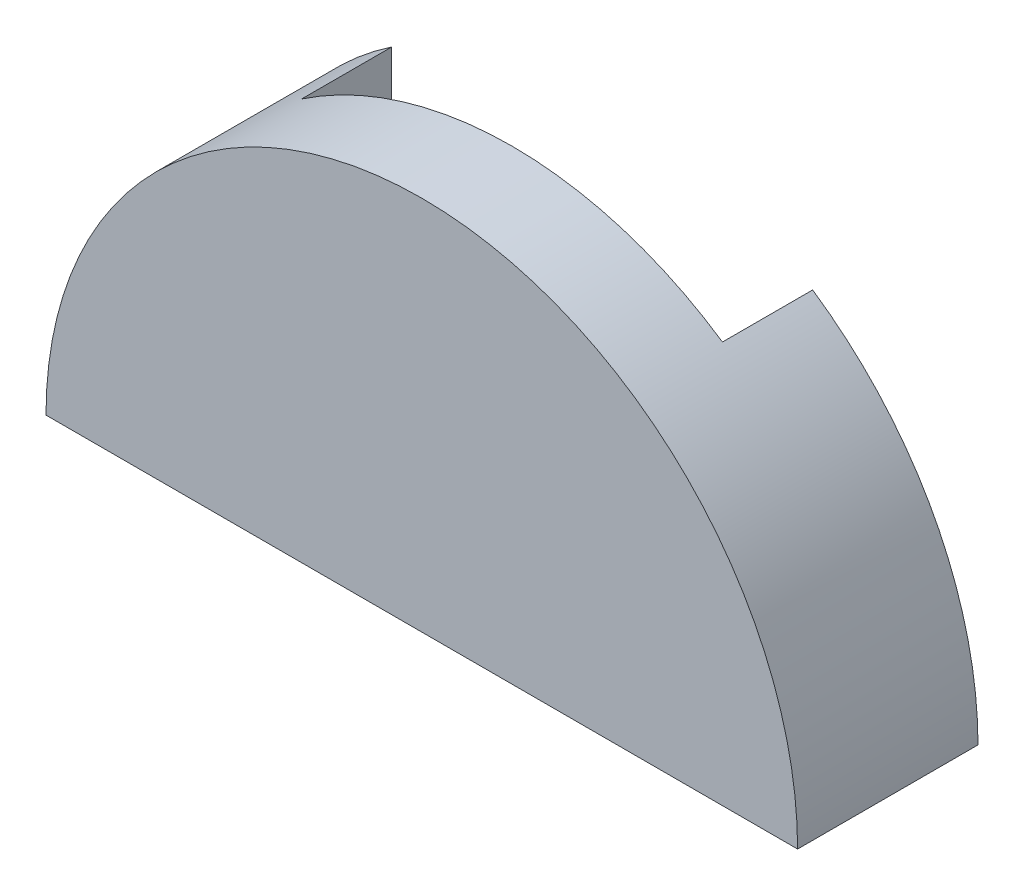
ISO-10303-21;
HEADER;
FILE_DESCRIPTION(('STEP AP214'),'2;1');
FILE_NAME('part.step','',(''),(''),'','','');
FILE_SCHEMA(('AUTOMOTIVE_DESIGN { 1 0 10303 214 1 1 1 1 }'));
ENDSEC;
DATA;
#1=APPLICATION_CONTEXT('core data for automotive mechanical design processes');
#2=APPLICATION_PROTOCOL_DEFINITION('international standard','automotive_design',2000,#1);
#3=PRODUCT_CONTEXT('',#1,'mechanical');
#4=PRODUCT('Part','Part','',(#3));
#5=PRODUCT_RELATED_PRODUCT_CATEGORY('part','',(#4));
#6=PRODUCT_DEFINITION_FORMATION('','',#4);
#7=PRODUCT_DEFINITION_CONTEXT('part definition',#1,'design');
#8=PRODUCT_DEFINITION('design','',#6,#7);
#9=PRODUCT_DEFINITION_SHAPE('','',#8);
#10=(LENGTH_UNIT() NAMED_UNIT(*) SI_UNIT(.MILLI.,.METRE.));
#11=(NAMED_UNIT(*) PLANE_ANGLE_UNIT() SI_UNIT($,.RADIAN.));
#12=(NAMED_UNIT(*) SI_UNIT($,.STERADIAN.) SOLID_ANGLE_UNIT());
#13=UNCERTAINTY_MEASURE_WITH_UNIT(LENGTH_MEASURE(1.E-05),#10,'distance_accuracy_value','');
#14=(GEOMETRIC_REPRESENTATION_CONTEXT(3) GLOBAL_UNCERTAINTY_ASSIGNED_CONTEXT((#13)) GLOBAL_UNIT_ASSIGNED_CONTEXT((#10,
#11,#12)) REPRESENTATION_CONTEXT('',''));
#15=CARTESIAN_POINT('',(0.,0.,0.));
#16=DIRECTION('',(0.,0.,1.));
#17=DIRECTION('',(1.,0.,0.));
#18=AXIS2_PLACEMENT_3D('',#15,#16,#17);
#19=CARTESIAN_POINT('',(0.,0.,7.62));
#20=DIRECTION('',(0.,1.,0.));
#21=DIRECTION('',(0.,0.,1.));
#22=AXIS2_PLACEMENT_3D('',#19,#20,#21);
#23=PLANE('',#22);
#24=DIRECTION('',(1.,0.,0.));
#25=VECTOR('',#24,1.);
#26=CARTESIAN_POINT('',(0.,0.,-7.62));
#27=LINE('',#26,#25);
#28=CARTESIAN_POINT('',(-31.75,0.,-7.62));
#29=VERTEX_POINT('',#28);
#30=CARTESIAN_POINT('',(31.75,0.,-7.62));
#31=VERTEX_POINT('',#30);
#32=EDGE_CURVE('E91',#29,#31,#27,.T.);
#33=ORIENTED_EDGE('',*,*,#32,.T.);
#34=DIRECTION('',(0.,0.,-1.));
#35=VECTOR('',#34,1.);
#36=CARTESIAN_POINT('',(31.75,0.,7.62));
#37=LINE('',#36,#35);
#38=CARTESIAN_POINT('',(31.75,0.,7.62));
#39=VERTEX_POINT('',#38);
#40=EDGE_CURVE('E11',#39,#31,#37,.T.);
#41=ORIENTED_EDGE('',*,*,#40,.F.);
#42=DIRECTION('',(1.,0.,0.));
#43=VECTOR('',#42,1.);
#44=CARTESIAN_POINT('',(0.,0.,7.62));
#45=LINE('',#44,#43);
#46=CARTESIAN_POINT('',(-31.75,0.,7.62));
#47=VERTEX_POINT('',#46);
#48=EDGE_CURVE('E96',#47,#39,#45,.T.);
#49=ORIENTED_EDGE('',*,*,#48,.F.);
#50=DIRECTION('',(0.,0.,-1.));
#51=VECTOR('',#50,1.);
#52=CARTESIAN_POINT('',(-31.75,0.,7.62));
#53=LINE('',#52,#51);
#54=EDGE_CURVE('E49',#47,#29,#53,.T.);
#55=ORIENTED_EDGE('',*,*,#54,.T.);
#56=EDGE_LOOP('',(#33,#41,#49,#55));
#57=FACE_BOUND('',#56,.T.);
#58=ADVANCED_FACE('F41',(#57),#23,.F.);
#59=CARTESIAN_POINT('',(0.,0.,7.62));
#60=DIRECTION('',(0.,0.,-1.));
#61=DIRECTION('',(-1.,0.,0.));
#62=AXIS2_PLACEMENT_3D('',#59,#60,#61);
#63=CYLINDRICAL_SURFACE('',#62,31.75);
#64=CARTESIAN_POINT('',(0.,0.,-7.62));
#65=DIRECTION('',(0.,0.,1.));
#66=DIRECTION('',(1.,0.,0.));
#67=AXIS2_PLACEMENT_3D('',#64,#65,#66);
#68=CIRCLE('',#67,31.75);
#69=CARTESIAN_POINT('',(17.78,26.3046402750541,-7.62));
#70=VERTEX_POINT('',#69);
#71=EDGE_CURVE('E90',#31,#70,#68,.T.);
#72=ORIENTED_EDGE('',*,*,#71,.T.);
#73=DIRECTION('',(0.,0.,1.));
#74=VECTOR('',#73,1.);
#75=CARTESIAN_POINT('',(17.78,26.3046402750541,-7.62));
#76=LINE('',#75,#74);
#77=CARTESIAN_POINT('',(17.78,26.3046402750541,0.));
#78=VERTEX_POINT('',#77);
#79=EDGE_CURVE('E115',#70,#78,#76,.T.);
#80=ORIENTED_EDGE('',*,*,#79,.T.);
#81=CARTESIAN_POINT('',(0.,0.,0.));
#82=DIRECTION('',(0.,0.,1.));
#83=DIRECTION('',(1.,0.,0.));
#84=AXIS2_PLACEMENT_3D('',#81,#82,#83);
#85=CIRCLE('',#84,31.75);
#86=CARTESIAN_POINT('',(-17.78,26.3046402750541,0.));
#87=VERTEX_POINT('',#86);
#88=EDGE_CURVE('E131',#78,#87,#85,.T.);
#89=ORIENTED_EDGE('',*,*,#88,.T.);
#90=DIRECTION('',(0.,0.,1.));
#91=VECTOR('',#90,1.);
#92=CARTESIAN_POINT('',(-17.78,26.3046402750541,-7.62));
#93=LINE('',#92,#91);
#94=CARTESIAN_POINT('',(-17.78,26.3046402750541,-7.62));
#95=VERTEX_POINT('',#94);
#96=EDGE_CURVE('E85',#95,#87,#93,.T.);
#97=ORIENTED_EDGE('',*,*,#96,.F.);
#98=EDGE_CURVE('E77',#95,#29,#68,.T.);
#99=ORIENTED_EDGE('',*,*,#98,.T.);
#100=ORIENTED_EDGE('',*,*,#54,.F.);
#101=CARTESIAN_POINT('',(0.,0.,7.62));
#102=DIRECTION('',(0.,0.,1.));
#103=DIRECTION('',(1.,0.,0.));
#104=AXIS2_PLACEMENT_3D('',#101,#102,#103);
#105=CIRCLE('',#104,31.75);
#106=EDGE_CURVE('E64',#39,#47,#105,.T.);
#107=ORIENTED_EDGE('',*,*,#106,.F.);
#108=ORIENTED_EDGE('',*,*,#40,.T.);
#109=EDGE_LOOP('',(#72,#80,#89,#97,#99,#100,#107,#108));
#110=FACE_BOUND('',#109,.T.);
#111=ADVANCED_FACE('F80',(#110),#63,.T.);
#112=CARTESIAN_POINT('',(0.,0.,7.62));
#113=DIRECTION('',(0.,0.,1.));
#114=DIRECTION('',(1.,0.,0.));
#115=AXIS2_PLACEMENT_3D('',#112,#113,#114);
#116=PLANE('',#115);
#117=ORIENTED_EDGE('',*,*,#48,.T.);
#118=ORIENTED_EDGE('',*,*,#106,.T.);
#119=EDGE_LOOP('',(#117,#118));
#120=FACE_BOUND('',#119,.T.);
#121=ADVANCED_FACE('F179',(#120),#116,.T.);
#122=CARTESIAN_POINT('',(0.,0.,-7.62));
#123=DIRECTION('',(0.,0.,1.));
#124=DIRECTION('',(1.,0.,0.));
#125=AXIS2_PLACEMENT_3D('',#122,#123,#124);
#126=PLANE('',#125);
#127=DIRECTION('',(1.,0.,0.));
#128=VECTOR('',#127,1.);
#129=CARTESIAN_POINT('',(0.,7.62,-7.62));
#130=LINE('',#129,#128);
#131=CARTESIAN_POINT('',(-17.78,7.62,-7.62));
#132=VERTEX_POINT('',#131);
#133=CARTESIAN_POINT('',(17.78,7.62,-7.62));
#134=VERTEX_POINT('',#133);
#135=EDGE_CURVE('E56',#132,#134,#130,.T.);
#136=ORIENTED_EDGE('',*,*,#135,.T.);
#137=DIRECTION('',(0.,1.,0.));
#138=VECTOR('',#137,1.);
#139=CARTESIAN_POINT('',(17.78,0.,-7.62));
#140=LINE('',#139,#138);
#141=EDGE_CURVE('E126',#134,#70,#140,.T.);
#142=ORIENTED_EDGE('',*,*,#141,.T.);
#143=ORIENTED_EDGE('',*,*,#71,.F.);
#144=ORIENTED_EDGE('',*,*,#32,.F.);
#145=ORIENTED_EDGE('',*,*,#98,.F.);
#146=DIRECTION('',(0.,1.,0.));
#147=VECTOR('',#146,1.);
#148=CARTESIAN_POINT('',(-17.78,0.,-7.62));
#149=LINE('',#148,#147);
#150=EDGE_CURVE('E140',#132,#95,#149,.T.);
#151=ORIENTED_EDGE('',*,*,#150,.F.);
#152=EDGE_LOOP('',(#136,#142,#143,#144,#145,#151));
#153=FACE_BOUND('',#152,.T.);
#154=ADVANCED_FACE('F98',(#153),#126,.F.);
#155=CARTESIAN_POINT('',(17.78,0.,-7.62));
#156=DIRECTION('',(1.,0.,0.));
#157=DIRECTION('',(0.,1.,0.));
#158=AXIS2_PLACEMENT_3D('',#155,#156,#157);
#159=PLANE('',#158);
#160=DIRECTION('',(0.,1.,0.));
#161=VECTOR('',#160,1.);
#162=CARTESIAN_POINT('',(17.78,0.,0.));
#163=LINE('',#162,#161);
#164=CARTESIAN_POINT('',(17.78,7.62,0.));
#165=VERTEX_POINT('',#164);
#166=EDGE_CURVE('E134',#165,#78,#163,.T.);
#167=ORIENTED_EDGE('',*,*,#166,.T.);
#168=ORIENTED_EDGE('',*,*,#79,.F.);
#169=ORIENTED_EDGE('',*,*,#141,.F.);
#170=DIRECTION('',(0.,0.,1.));
#171=VECTOR('',#170,1.);
#172=CARTESIAN_POINT('',(17.78,7.62,-7.62));
#173=LINE('',#172,#171);
#174=EDGE_CURVE('E101',#134,#165,#173,.T.);
#175=ORIENTED_EDGE('',*,*,#174,.T.);
#176=EDGE_LOOP('',(#167,#168,#169,#175));
#177=FACE_BOUND('',#176,.T.);
#178=ADVANCED_FACE('F150',(#177),#159,.F.);
#179=CARTESIAN_POINT('',(0.,7.62,-7.62));
#180=DIRECTION('',(0.,-1.,0.));
#181=DIRECTION('',(1.,0.,0.));
#182=AXIS2_PLACEMENT_3D('',#179,#180,#181);
#183=PLANE('',#182);
#184=DIRECTION('',(1.,0.,0.));
#185=VECTOR('',#184,1.);
#186=CARTESIAN_POINT('',(0.,7.62,0.));
#187=LINE('',#186,#185);
#188=CARTESIAN_POINT('',(-17.78,7.62,0.));
#189=VERTEX_POINT('',#188);
#190=EDGE_CURVE('E122',#189,#165,#187,.T.);
#191=ORIENTED_EDGE('',*,*,#190,.T.);
#192=ORIENTED_EDGE('',*,*,#174,.F.);
#193=ORIENTED_EDGE('',*,*,#135,.F.);
#194=DIRECTION('',(0.,0.,1.));
#195=VECTOR('',#194,1.);
#196=CARTESIAN_POINT('',(-17.78,7.62,-7.62));
#197=LINE('',#196,#195);
#198=EDGE_CURVE('E105',#132,#189,#197,.T.);
#199=ORIENTED_EDGE('',*,*,#198,.T.);
#200=EDGE_LOOP('',(#191,#192,#193,#199));
#201=FACE_BOUND('',#200,.T.);
#202=ADVANCED_FACE('F162',(#201),#183,.F.);
#203=CARTESIAN_POINT('',(-17.78,0.,-7.62));
#204=DIRECTION('',(1.,0.,0.));
#205=DIRECTION('',(0.,1.,0.));
#206=AXIS2_PLACEMENT_3D('',#203,#204,#205);
#207=PLANE('',#206);
#208=DIRECTION('',(0.,1.,0.));
#209=VECTOR('',#208,1.);
#210=CARTESIAN_POINT('',(-17.78,0.,0.));
#211=LINE('',#210,#209);
#212=EDGE_CURVE('E127',#189,#87,#211,.T.);
#213=ORIENTED_EDGE('',*,*,#212,.F.);
#214=ORIENTED_EDGE('',*,*,#198,.F.);
#215=ORIENTED_EDGE('',*,*,#150,.T.);
#216=ORIENTED_EDGE('',*,*,#96,.T.);
#217=EDGE_LOOP('',(#213,#214,#215,#216));
#218=FACE_BOUND('',#217,.T.);
#219=ADVANCED_FACE('F165',(#218),#207,.T.);
#220=CARTESIAN_POINT('',(0.,0.,0.));
#221=DIRECTION('',(0.,0.,1.));
#222=DIRECTION('',(1.,0.,0.));
#223=AXIS2_PLACEMENT_3D('',#220,#221,#222);
#224=PLANE('',#223);
#225=ORIENTED_EDGE('',*,*,#166,.F.);
#226=ORIENTED_EDGE('',*,*,#190,.F.);
#227=ORIENTED_EDGE('',*,*,#212,.T.);
#228=ORIENTED_EDGE('',*,*,#88,.F.);
#229=EDGE_LOOP('',(#225,#226,#227,#228));
#230=FACE_BOUND('',#229,.T.);
#231=ADVANCED_FACE('F167',(#230),#224,.F.);
#232=CLOSED_SHELL('',(#58,#111,#121,#154,#178,#202,#219,#231));
#233=MANIFOLD_SOLID_BREP('B2',#232);
#234=ADVANCED_BREP_SHAPE_REPRESENTATION('',(#18,#233),#14);
#235=SHAPE_DEFINITION_REPRESENTATION(#9,#234);
ENDSEC;
END-ISO-10303-21;
